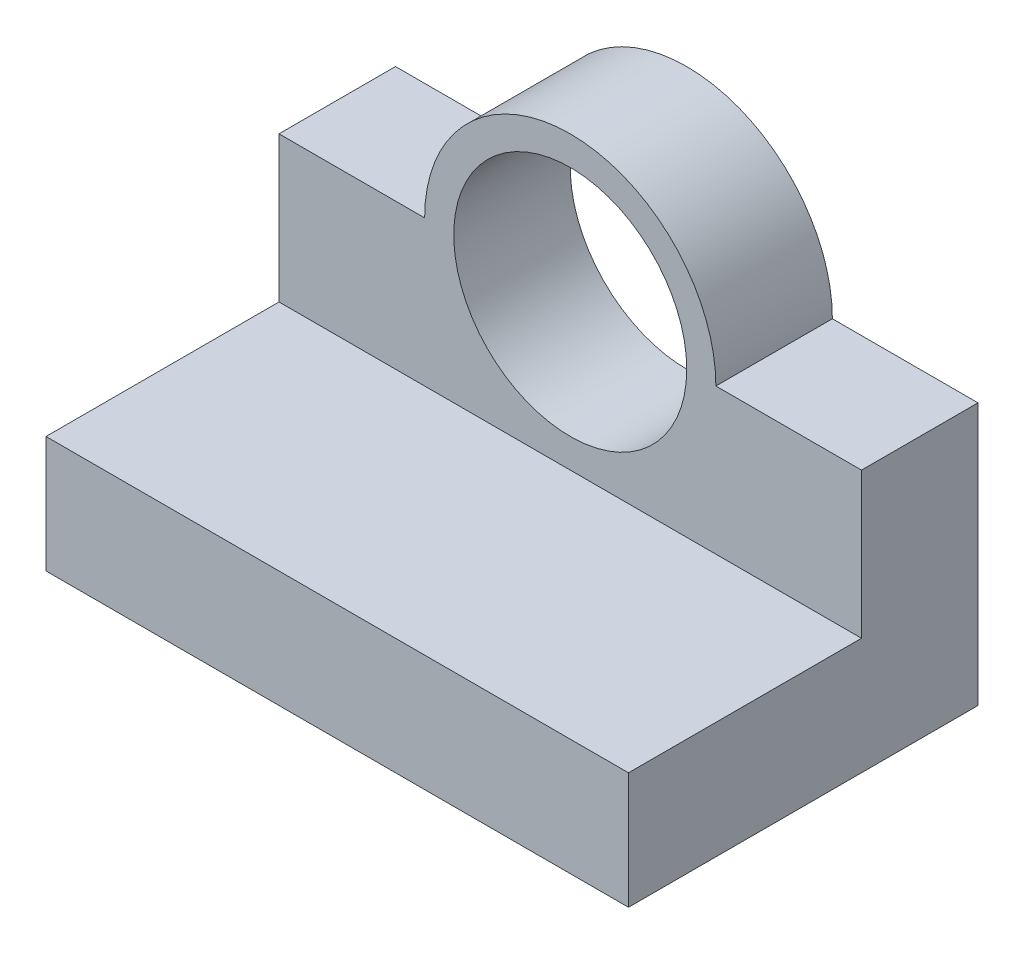
ISO-10303-21;
HEADER;
FILE_DESCRIPTION(('STEP AP214'),'2;1');
FILE_NAME('part.step','',(''),(''),'','','');
FILE_SCHEMA(('AUTOMOTIVE_DESIGN { 1 0 10303 214 1 1 1 1 }'));
ENDSEC;
DATA;
#1=APPLICATION_CONTEXT('core data for automotive mechanical design processes');
#2=APPLICATION_PROTOCOL_DEFINITION('international standard','automotive_design',2000,#1);
#3=PRODUCT_CONTEXT('',#1,'mechanical');
#4=PRODUCT('Part','Part','',(#3));
#5=PRODUCT_RELATED_PRODUCT_CATEGORY('part','',(#4));
#6=PRODUCT_DEFINITION_FORMATION('','',#4);
#7=PRODUCT_DEFINITION_CONTEXT('part definition',#1,'design');
#8=PRODUCT_DEFINITION('design','',#6,#7);
#9=PRODUCT_DEFINITION_SHAPE('','',#8);
#10=(LENGTH_UNIT() NAMED_UNIT(*) SI_UNIT(.MILLI.,.METRE.));
#11=(NAMED_UNIT(*) PLANE_ANGLE_UNIT() SI_UNIT($,.RADIAN.));
#12=(NAMED_UNIT(*) SI_UNIT($,.STERADIAN.) SOLID_ANGLE_UNIT());
#13=UNCERTAINTY_MEASURE_WITH_UNIT(LENGTH_MEASURE(1.E-05),#10,'distance_accuracy_value','');
#14=(GEOMETRIC_REPRESENTATION_CONTEXT(3) GLOBAL_UNCERTAINTY_ASSIGNED_CONTEXT((#13)) GLOBAL_UNIT_ASSIGNED_CONTEXT((#10,
#11,#12)) REPRESENTATION_CONTEXT('',''));
#15=CARTESIAN_POINT('',(0.,0.,0.));
#16=DIRECTION('',(0.,0.,1.));
#17=DIRECTION('',(1.,0.,0.));
#18=AXIS2_PLACEMENT_3D('',#15,#16,#17);
#19=CARTESIAN_POINT('',(50.,25.,20.));
#20=DIRECTION('',(0.,0.,1.));
#21=DIRECTION('',(1.,0.,0.));
#22=AXIS2_PLACEMENT_3D('',#19,#20,#21);
#23=PLANE('',#22);
#24=DIRECTION('',(-1.,0.,0.));
#25=VECTOR('',#24,1.);
#26=CARTESIAN_POINT('',(0.,0.,20.));
#27=LINE('',#26,#25);
#28=CARTESIAN_POINT('',(100.,0.,20.));
#29=VERTEX_POINT('',#28);
#30=CARTESIAN_POINT('',(0.,0.,20.));
#31=VERTEX_POINT('',#30);
#32=EDGE_CURVE('E55',#29,#31,#27,.T.);
#33=ORIENTED_EDGE('',*,*,#32,.F.);
#34=DIRECTION('',(0.,1.,0.));
#35=VECTOR('',#34,1.);
#36=CARTESIAN_POINT('',(100.,0.,20.));
#37=LINE('',#36,#35);
#38=CARTESIAN_POINT('',(100.,25.,20.));
#39=VERTEX_POINT('',#38);
#40=EDGE_CURVE('E87',#29,#39,#37,.T.);
#41=ORIENTED_EDGE('',*,*,#40,.T.);
#42=DIRECTION('',(-1.,0.,0.));
#43=VECTOR('',#42,1.);
#44=CARTESIAN_POINT('',(75.,25.,20.));
#45=LINE('',#44,#43);
#46=CARTESIAN_POINT('',(75.,25.,20.));
#47=VERTEX_POINT('',#46);
#48=EDGE_CURVE('E171',#39,#47,#45,.T.);
#49=ORIENTED_EDGE('',*,*,#48,.T.);
#50=CARTESIAN_POINT('',(50.,25.,20.));
#51=DIRECTION('',(0.,0.,1.));
#52=DIRECTION('',(1.,0.,0.));
#53=AXIS2_PLACEMENT_3D('',#50,#51,#52);
#54=CIRCLE('',#53,25.);
#55=CARTESIAN_POINT('',(25.,25.,20.));
#56=VERTEX_POINT('',#55);
#57=EDGE_CURVE('E174',#47,#56,#54,.T.);
#58=ORIENTED_EDGE('',*,*,#57,.T.);
#59=DIRECTION('',(-1.,0.,0.));
#60=VECTOR('',#59,1.);
#61=CARTESIAN_POINT('',(0.,25.,20.));
#62=LINE('',#61,#60);
#63=CARTESIAN_POINT('',(0.,25.,20.));
#64=VERTEX_POINT('',#63);
#65=EDGE_CURVE('E62',#56,#64,#62,.T.);
#66=ORIENTED_EDGE('',*,*,#65,.T.);
#67=DIRECTION('',(0.,-1.,0.));
#68=VECTOR('',#67,1.);
#69=CARTESIAN_POINT('',(0.,25.,20.));
#70=LINE('',#69,#68);
#71=EDGE_CURVE('E166',#64,#31,#70,.T.);
#72=ORIENTED_EDGE('',*,*,#71,.T.);
#73=EDGE_LOOP('',(#33,#41,#49,#58,#66,#72));
#74=FACE_BOUND('',#73,.T.);
#75=CARTESIAN_POINT('',(50.,25.,20.));
#76=DIRECTION('',(0.,0.,1.));
#77=DIRECTION('',(1.,0.,0.));
#78=AXIS2_PLACEMENT_3D('',#75,#76,#77);
#79=CIRCLE('',#78,20.);
#80=CARTESIAN_POINT('',(70.,25.,20.));
#81=VERTEX_POINT('',#80);
#82=EDGE_CURVE('E159',#81,#81,#79,.T.);
#83=ORIENTED_EDGE('',*,*,#82,.F.);
#84=EDGE_LOOP('',(#83));
#85=FACE_BOUND('',#84,.T.);
#86=ADVANCED_FACE('F39',(#74,#85),#23,.T.);
#87=CARTESIAN_POINT('',(50.,25.,0.));
#88=DIRECTION('',(0.,0.,1.));
#89=DIRECTION('',(1.,0.,0.));
#90=AXIS2_PLACEMENT_3D('',#87,#88,#89);
#91=PLANE('',#90);
#92=DIRECTION('',(0.,-1.,0.));
#93=VECTOR('',#92,1.);
#94=CARTESIAN_POINT('',(0.,25.,0.));
#95=LINE('',#94,#93);
#96=CARTESIAN_POINT('',(0.,25.,0.));
#97=VERTEX_POINT('',#96);
#98=CARTESIAN_POINT('',(0.,-20.,0.));
#99=VERTEX_POINT('',#98);
#100=EDGE_CURVE('E117',#97,#99,#95,.T.);
#101=ORIENTED_EDGE('',*,*,#100,.F.);
#102=DIRECTION('',(-1.,0.,0.));
#103=VECTOR('',#102,1.);
#104=CARTESIAN_POINT('',(0.,25.,0.));
#105=LINE('',#104,#103);
#106=CARTESIAN_POINT('',(25.,25.,0.));
#107=VERTEX_POINT('',#106);
#108=EDGE_CURVE('E83',#107,#97,#105,.T.);
#109=ORIENTED_EDGE('',*,*,#108,.F.);
#110=CARTESIAN_POINT('',(50.,25.,0.));
#111=DIRECTION('',(0.,0.,1.));
#112=DIRECTION('',(1.,0.,0.));
#113=AXIS2_PLACEMENT_3D('',#110,#111,#112);
#114=CIRCLE('',#113,25.);
#115=CARTESIAN_POINT('',(75.,25.,0.));
#116=VERTEX_POINT('',#115);
#117=EDGE_CURVE('E188',#116,#107,#114,.T.);
#118=ORIENTED_EDGE('',*,*,#117,.F.);
#119=DIRECTION('',(-1.,0.,0.));
#120=VECTOR('',#119,1.);
#121=CARTESIAN_POINT('',(75.,25.,0.));
#122=LINE('',#121,#120);
#123=CARTESIAN_POINT('',(100.,25.,0.));
#124=VERTEX_POINT('',#123);
#125=EDGE_CURVE('E185',#124,#116,#122,.T.);
#126=ORIENTED_EDGE('',*,*,#125,.F.);
#127=DIRECTION('',(0.,1.,0.));
#128=VECTOR('',#127,1.);
#129=CARTESIAN_POINT('',(100.,0.,0.));
#130=LINE('',#129,#128);
#131=CARTESIAN_POINT('',(100.,-20.,0.));
#132=VERTEX_POINT('',#131);
#133=EDGE_CURVE('E182',#132,#124,#130,.T.);
#134=ORIENTED_EDGE('',*,*,#133,.F.);
#135=DIRECTION('',(1.,0.,0.));
#136=VECTOR('',#135,1.);
#137=CARTESIAN_POINT('',(0.,-20.,0.));
#138=LINE('',#137,#136);
#139=EDGE_CURVE('E122',#99,#132,#138,.T.);
#140=ORIENTED_EDGE('',*,*,#139,.F.);
#141=EDGE_LOOP('',(#101,#109,#118,#126,#134,#140));
#142=FACE_BOUND('',#141,.T.);
#143=CARTESIAN_POINT('',(50.,25.,0.));
#144=DIRECTION('',(0.,0.,1.));
#145=DIRECTION('',(1.,0.,0.));
#146=AXIS2_PLACEMENT_3D('',#143,#144,#145);
#147=CIRCLE('',#146,20.);
#148=CARTESIAN_POINT('',(70.,25.,0.));
#149=VERTEX_POINT('',#148);
#150=EDGE_CURVE('E158',#149,#149,#147,.T.);
#151=ORIENTED_EDGE('',*,*,#150,.T.);
#152=EDGE_LOOP('',(#151));
#153=FACE_BOUND('',#152,.T.);
#154=ADVANCED_FACE('F209',(#142,#153),#91,.F.);
#155=CARTESIAN_POINT('',(0.,25.,20.));
#156=DIRECTION('',(1.,0.,0.));
#157=DIRECTION('',(0.,1.,0.));
#158=AXIS2_PLACEMENT_3D('',#155,#156,#157);
#159=PLANE('',#158);
#160=ORIENTED_EDGE('',*,*,#100,.T.);
#161=DIRECTION('',(0.,0.,-1.));
#162=VECTOR('',#161,1.);
#163=CARTESIAN_POINT('',(0.,-20.,0.));
#164=LINE('',#163,#162);
#165=CARTESIAN_POINT('',(0.,-20.,60.));
#166=VERTEX_POINT('',#165);
#167=EDGE_CURVE('E111',#166,#99,#164,.T.);
#168=ORIENTED_EDGE('',*,*,#167,.F.);
#169=DIRECTION('',(0.,-1.,0.));
#170=VECTOR('',#169,1.);
#171=CARTESIAN_POINT('',(0.,-20.,60.));
#172=LINE('',#171,#170);
#173=CARTESIAN_POINT('',(0.,0.,60.));
#174=VERTEX_POINT('',#173);
#175=EDGE_CURVE('E115',#174,#166,#172,.T.);
#176=ORIENTED_EDGE('',*,*,#175,.F.);
#177=DIRECTION('',(0.,0.,-1.));
#178=VECTOR('',#177,1.);
#179=CARTESIAN_POINT('',(0.,0.,60.));
#180=LINE('',#179,#178);
#181=EDGE_CURVE('E147',#174,#31,#180,.T.);
#182=ORIENTED_EDGE('',*,*,#181,.T.);
#183=ORIENTED_EDGE('',*,*,#71,.F.);
#184=DIRECTION('',(0.,0.,-1.));
#185=VECTOR('',#184,1.);
#186=CARTESIAN_POINT('',(0.,25.,20.));
#187=LINE('',#186,#185);
#188=EDGE_CURVE('E179',#64,#97,#187,.T.);
#189=ORIENTED_EDGE('',*,*,#188,.T.);
#190=EDGE_LOOP('',(#160,#168,#176,#182,#183,#189));
#191=FACE_BOUND('',#190,.T.);
#192=ADVANCED_FACE('F41',(#191),#159,.F.);
#193=CARTESIAN_POINT('',(100.,0.,20.));
#194=DIRECTION('',(-1.,0.,0.));
#195=DIRECTION('',(0.,0.,1.));
#196=AXIS2_PLACEMENT_3D('',#193,#194,#195);
#197=PLANE('',#196);
#198=ORIENTED_EDGE('',*,*,#133,.T.);
#199=DIRECTION('',(0.,0.,-1.));
#200=VECTOR('',#199,1.);
#201=CARTESIAN_POINT('',(100.,25.,20.));
#202=LINE('',#201,#200);
#203=EDGE_CURVE('E11',#39,#124,#202,.T.);
#204=ORIENTED_EDGE('',*,*,#203,.F.);
#205=ORIENTED_EDGE('',*,*,#40,.F.);
#206=DIRECTION('',(0.,0.,-1.));
#207=VECTOR('',#206,1.);
#208=CARTESIAN_POINT('',(100.,0.,60.));
#209=LINE('',#208,#207);
#210=CARTESIAN_POINT('',(100.,0.,60.));
#211=VERTEX_POINT('',#210);
#212=EDGE_CURVE('E123',#211,#29,#209,.T.);
#213=ORIENTED_EDGE('',*,*,#212,.F.);
#214=DIRECTION('',(0.,1.,0.));
#215=VECTOR('',#214,1.);
#216=CARTESIAN_POINT('',(100.,-20.,60.));
#217=LINE('',#216,#215);
#218=CARTESIAN_POINT('',(100.,-20.,60.));
#219=VERTEX_POINT('',#218);
#220=EDGE_CURVE('E133',#219,#211,#217,.T.);
#221=ORIENTED_EDGE('',*,*,#220,.F.);
#222=DIRECTION('',(0.,0.,1.));
#223=VECTOR('',#222,1.);
#224=CARTESIAN_POINT('',(100.,-20.,0.));
#225=LINE('',#224,#223);
#226=EDGE_CURVE('E129',#132,#219,#225,.T.);
#227=ORIENTED_EDGE('',*,*,#226,.F.);
#228=EDGE_LOOP('',(#198,#204,#205,#213,#221,#227));
#229=FACE_BOUND('',#228,.T.);
#230=ADVANCED_FACE('F212',(#229),#197,.F.);
#231=CARTESIAN_POINT('',(75.,25.,20.));
#232=DIRECTION('',(0.,-1.,0.));
#233=DIRECTION('',(0.,0.,-1.));
#234=AXIS2_PLACEMENT_3D('',#231,#232,#233);
#235=PLANE('',#234);
#236=ORIENTED_EDGE('',*,*,#125,.T.);
#237=DIRECTION('',(0.,0.,-1.));
#238=VECTOR('',#237,1.);
#239=CARTESIAN_POINT('',(75.,25.,20.));
#240=LINE('',#239,#238);
#241=EDGE_CURVE('E48',#47,#116,#240,.T.);
#242=ORIENTED_EDGE('',*,*,#241,.F.);
#243=ORIENTED_EDGE('',*,*,#48,.F.);
#244=ORIENTED_EDGE('',*,*,#203,.T.);
#245=EDGE_LOOP('',(#236,#242,#243,#244));
#246=FACE_BOUND('',#245,.T.);
#247=ADVANCED_FACE('F238',(#246),#235,.F.);
#248=CARTESIAN_POINT('',(50.,25.,20.));
#249=DIRECTION('',(0.,0.,-1.));
#250=DIRECTION('',(-1.,0.,0.));
#251=AXIS2_PLACEMENT_3D('',#248,#249,#250);
#252=CYLINDRICAL_SURFACE('',#251,25.);
#253=ORIENTED_EDGE('',*,*,#117,.T.);
#254=DIRECTION('',(0.,0.,-1.));
#255=VECTOR('',#254,1.);
#256=CARTESIAN_POINT('',(25.,25.,20.));
#257=LINE('',#256,#255);
#258=EDGE_CURVE('E195',#56,#107,#257,.T.);
#259=ORIENTED_EDGE('',*,*,#258,.F.);
#260=ORIENTED_EDGE('',*,*,#57,.F.);
#261=ORIENTED_EDGE('',*,*,#241,.T.);
#262=EDGE_LOOP('',(#253,#259,#260,#261));
#263=FACE_BOUND('',#262,.T.);
#264=ADVANCED_FACE('F203',(#263),#252,.T.);
#265=CARTESIAN_POINT('',(0.,25.,20.));
#266=DIRECTION('',(0.,-1.,0.));
#267=DIRECTION('',(0.,0.,-1.));
#268=AXIS2_PLACEMENT_3D('',#265,#266,#267);
#269=PLANE('',#268);
#270=ORIENTED_EDGE('',*,*,#108,.T.);
#271=ORIENTED_EDGE('',*,*,#188,.F.);
#272=ORIENTED_EDGE('',*,*,#65,.F.);
#273=ORIENTED_EDGE('',*,*,#258,.T.);
#274=EDGE_LOOP('',(#270,#271,#272,#273));
#275=FACE_BOUND('',#274,.T.);
#276=ADVANCED_FACE('F225',(#275),#269,.F.);
#277=CARTESIAN_POINT('',(50.,25.,20.));
#278=DIRECTION('',(0.,0.,-1.));
#279=DIRECTION('',(-1.,0.,0.));
#280=AXIS2_PLACEMENT_3D('',#277,#278,#279);
#281=CYLINDRICAL_SURFACE('',#280,20.);
#282=ORIENTED_EDGE('',*,*,#82,.T.);
#283=EDGE_LOOP('',(#282));
#284=FACE_BOUND('',#283,.T.);
#285=ORIENTED_EDGE('',*,*,#150,.F.);
#286=EDGE_LOOP('',(#285));
#287=FACE_BOUND('',#286,.T.);
#288=ADVANCED_FACE('F222',(#284,#287),#281,.F.);
#289=CARTESIAN_POINT('',(0.,-20.,0.));
#290=DIRECTION('',(0.,1.,0.));
#291=DIRECTION('',(0.,0.,1.));
#292=AXIS2_PLACEMENT_3D('',#289,#290,#291);
#293=PLANE('',#292);
#294=ORIENTED_EDGE('',*,*,#167,.T.);
#295=ORIENTED_EDGE('',*,*,#139,.T.);
#296=ORIENTED_EDGE('',*,*,#226,.T.);
#297=DIRECTION('',(1.,0.,0.));
#298=VECTOR('',#297,1.);
#299=CARTESIAN_POINT('',(0.,-20.,60.));
#300=LINE('',#299,#298);
#301=EDGE_CURVE('E126',#166,#219,#300,.T.);
#302=ORIENTED_EDGE('',*,*,#301,.F.);
#303=EDGE_LOOP('',(#294,#295,#296,#302));
#304=FACE_BOUND('',#303,.T.);
#305=ADVANCED_FACE('F127',(#304),#293,.F.);
#306=CARTESIAN_POINT('',(0.,0.,60.));
#307=DIRECTION('',(0.,-1.,0.));
#308=DIRECTION('',(0.,0.,-1.));
#309=AXIS2_PLACEMENT_3D('',#306,#307,#308);
#310=PLANE('',#309);
#311=ORIENTED_EDGE('',*,*,#32,.T.);
#312=ORIENTED_EDGE('',*,*,#181,.F.);
#313=DIRECTION('',(-1.,0.,0.));
#314=VECTOR('',#313,1.);
#315=CARTESIAN_POINT('',(0.,0.,60.));
#316=LINE('',#315,#314);
#317=EDGE_CURVE('E137',#211,#174,#316,.T.);
#318=ORIENTED_EDGE('',*,*,#317,.F.);
#319=ORIENTED_EDGE('',*,*,#212,.T.);
#320=EDGE_LOOP('',(#311,#312,#318,#319));
#321=FACE_BOUND('',#320,.T.);
#322=ADVANCED_FACE('F215',(#321),#310,.F.);
#323=CARTESIAN_POINT('',(0.,0.,60.));
#324=DIRECTION('',(0.,0.,-1.));
#325=DIRECTION('',(-1.,0.,0.));
#326=AXIS2_PLACEMENT_3D('',#323,#324,#325);
#327=PLANE('',#326);
#328=ORIENTED_EDGE('',*,*,#175,.T.);
#329=ORIENTED_EDGE('',*,*,#301,.T.);
#330=ORIENTED_EDGE('',*,*,#220,.T.);
#331=ORIENTED_EDGE('',*,*,#317,.T.);
#332=EDGE_LOOP('',(#328,#329,#330,#331));
#333=FACE_BOUND('',#332,.T.);
#334=ADVANCED_FACE('F135',(#333),#327,.F.);
#335=CLOSED_SHELL('',(#86,#154,#192,#230,#247,#264,#276,#288,#305,#322,#334));
#336=MANIFOLD_SOLID_BREP('B2',#335);
#337=ADVANCED_BREP_SHAPE_REPRESENTATION('',(#18,#336),#14);
#338=SHAPE_DEFINITION_REPRESENTATION(#9,#337);
ENDSEC;
END-ISO-10303-21;
